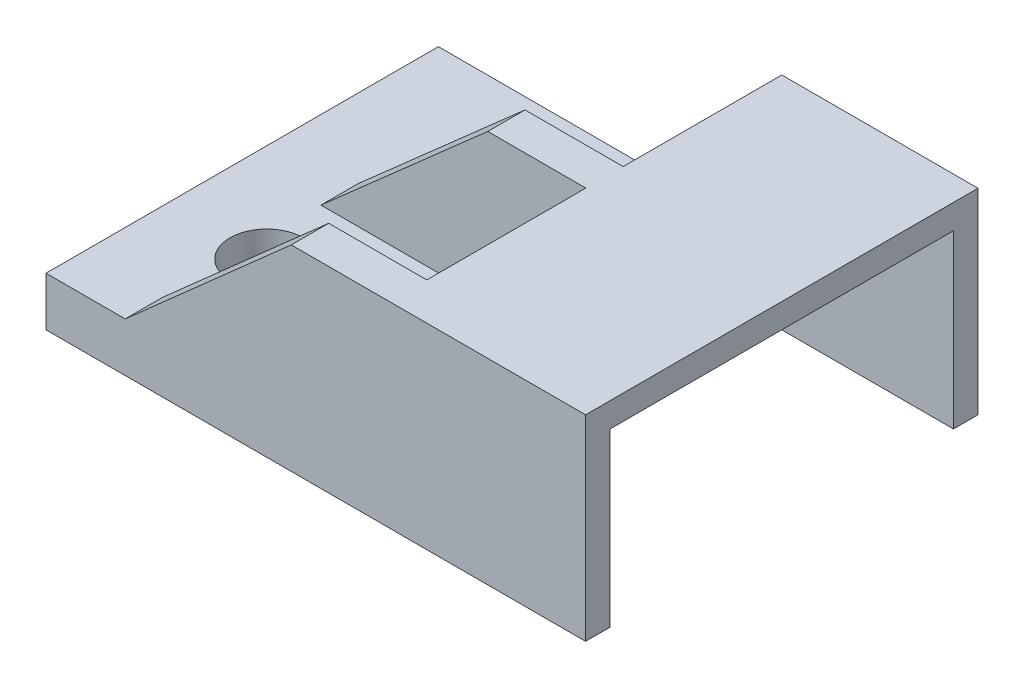
ISO-10303-21;
HEADER;
FILE_DESCRIPTION(('STEP AP214'),'2;1');
FILE_NAME('part.step','',(''),(''),'','','');
FILE_SCHEMA(('AUTOMOTIVE_DESIGN { 1 0 10303 214 1 1 1 1 }'));
ENDSEC;
DATA;
#1=APPLICATION_CONTEXT('core data for automotive mechanical design processes');
#2=APPLICATION_PROTOCOL_DEFINITION('international standard','automotive_design',2000,#1);
#3=PRODUCT_CONTEXT('',#1,'mechanical');
#4=PRODUCT('Part','Part','',(#3));
#5=PRODUCT_RELATED_PRODUCT_CATEGORY('part','',(#4));
#6=PRODUCT_DEFINITION_FORMATION('','',#4);
#7=PRODUCT_DEFINITION_CONTEXT('part definition',#1,'design');
#8=PRODUCT_DEFINITION('design','',#6,#7);
#9=PRODUCT_DEFINITION_SHAPE('','',#8);
#10=(LENGTH_UNIT() NAMED_UNIT(*) SI_UNIT(.MILLI.,.METRE.));
#11=(NAMED_UNIT(*) PLANE_ANGLE_UNIT() SI_UNIT($,.RADIAN.));
#12=(NAMED_UNIT(*) SI_UNIT($,.STERADIAN.) SOLID_ANGLE_UNIT());
#13=UNCERTAINTY_MEASURE_WITH_UNIT(LENGTH_MEASURE(1.E-05),#10,'distance_accuracy_value','');
#14=(GEOMETRIC_REPRESENTATION_CONTEXT(3) GLOBAL_UNCERTAINTY_ASSIGNED_CONTEXT((#13)) GLOBAL_UNIT_ASSIGNED_CONTEXT((#10,
#11,#12)) REPRESENTATION_CONTEXT('',''));
#15=CARTESIAN_POINT('',(0.,0.,0.));
#16=DIRECTION('',(0.,0.,1.));
#17=DIRECTION('',(1.,0.,0.));
#18=AXIS2_PLACEMENT_3D('',#15,#16,#17);
#19=CARTESIAN_POINT('',(0.,12.7,0.));
#20=DIRECTION('',(0.,0.,-1.));
#21=DIRECTION('',(-1.,0.,0.));
#22=AXIS2_PLACEMENT_3D('',#19,#20,#21);
#23=PLANE('',#22);
#24=DIRECTION('',(0.748452550188981,0.663188344375571,0.));
#25=VECTOR('',#24,1.);
#26=CARTESIAN_POINT('',(63.5002717956906,50.8,0.));
#27=LINE('',#26,#25);
#28=CARTESIAN_POINT('',(20.5018650775363,12.7,0.));
#29=VERTEX_POINT('',#28);
#30=CARTESIAN_POINT('',(63.5002717956906,50.8,0.));
#31=VERTEX_POINT('',#30);
#32=EDGE_CURVE('E421',#29,#31,#27,.T.);
#33=ORIENTED_EDGE('',*,*,#32,.F.);
#34=DIRECTION('',(1.,0.,0.));
#35=VECTOR('',#34,1.);
#36=CARTESIAN_POINT('',(0.,12.7,0.));
#37=LINE('',#36,#35);
#38=CARTESIAN_POINT('',(0.,12.7,0.));
#39=VERTEX_POINT('',#38);
#40=EDGE_CURVE('E299',#39,#29,#37,.T.);
#41=ORIENTED_EDGE('',*,*,#40,.F.);
#42=DIRECTION('',(0.,-1.,0.));
#43=VECTOR('',#42,1.);
#44=CARTESIAN_POINT('',(0.,12.7,0.));
#45=LINE('',#44,#43);
#46=CARTESIAN_POINT('',(0.,0.,0.));
#47=VERTEX_POINT('',#46);
#48=EDGE_CURVE('E69',#39,#47,#45,.T.);
#49=ORIENTED_EDGE('',*,*,#48,.T.);
#50=DIRECTION('',(1.,0.,0.));
#51=VECTOR('',#50,1.);
#52=CARTESIAN_POINT('',(0.,0.,0.));
#53=LINE('',#52,#51);
#54=CARTESIAN_POINT('',(139.7,0.,0.));
#55=VERTEX_POINT('',#54);
#56=EDGE_CURVE('E316',#47,#55,#53,.T.);
#57=ORIENTED_EDGE('',*,*,#56,.T.);
#58=DIRECTION('',(0.,-1.,0.));
#59=VECTOR('',#58,1.);
#60=CARTESIAN_POINT('',(139.7,12.7,0.));
#61=LINE('',#60,#59);
#62=CARTESIAN_POINT('',(139.7,50.8,0.));
#63=VERTEX_POINT('',#62);
#64=EDGE_CURVE('E324',#63,#55,#61,.T.);
#65=ORIENTED_EDGE('',*,*,#64,.F.);
#66=DIRECTION('',(1.,0.,0.));
#67=VECTOR('',#66,1.);
#68=CARTESIAN_POINT('',(88.9,50.8,0.));
#69=LINE('',#68,#67);
#70=EDGE_CURVE('E243',#31,#63,#69,.T.);
#71=ORIENTED_EDGE('',*,*,#70,.F.);
#72=EDGE_LOOP('',(#33,#41,#49,#57,#65,#71));
#73=FACE_BOUND('',#72,.T.);
#74=ADVANCED_FACE('F59',(#73),#23,.F.);
#75=CARTESIAN_POINT('',(0.,12.7,0.));
#76=DIRECTION('',(0.,1.,0.));
#77=DIRECTION('',(0.,0.,1.));
#78=AXIS2_PLACEMENT_3D('',#75,#76,#77);
#79=PLANE('',#78);
#80=DIRECTION('',(0.,0.,1.));
#81=VECTOR('',#80,1.);
#82=CARTESIAN_POINT('',(20.3202717956906,12.7,-60.5191424248304));
#83=LINE('',#82,#81);
#84=CARTESIAN_POINT('',(20.3202717956906,12.7,-60.5191424248304));
#85=VERTEX_POINT('',#84);
#86=CARTESIAN_POINT('',(20.3202717956906,12.7,-50.8671424248304));
#87=VERTEX_POINT('',#86);
#88=EDGE_CURVE('E180',#85,#87,#83,.T.);
#89=ORIENTED_EDGE('',*,*,#88,.F.);
#90=DIRECTION('',(-1.,0.,0.));
#91=VECTOR('',#90,1.);
#92=CARTESIAN_POINT('',(88.9,12.7,-60.5191424248304));
#93=LINE('',#92,#91);
#94=CARTESIAN_POINT('',(88.9,12.7,-60.5191424248304));
#95=VERTEX_POINT('',#94);
#96=EDGE_CURVE('E212',#95,#85,#93,.T.);
#97=ORIENTED_EDGE('',*,*,#96,.F.);
#98=DIRECTION('',(0.,0.,-1.));
#99=VECTOR('',#98,1.);
#100=CARTESIAN_POINT('',(88.9,12.7,0.));
#101=LINE('',#100,#99);
#102=CARTESIAN_POINT('',(88.9,12.7,-101.6));
#103=VERTEX_POINT('',#102);
#104=EDGE_CURVE('E258',#95,#103,#101,.T.);
#105=ORIENTED_EDGE('',*,*,#104,.T.);
#106=DIRECTION('',(1.,0.,0.));
#107=VECTOR('',#106,1.);
#108=CARTESIAN_POINT('',(0.,12.7,-101.6));
#109=LINE('',#108,#107);
#110=CARTESIAN_POINT('',(0.,12.7,-101.6));
#111=VERTEX_POINT('',#110);
#112=EDGE_CURVE('E295',#111,#103,#109,.T.);
#113=ORIENTED_EDGE('',*,*,#112,.F.);
#114=DIRECTION('',(0.,0.,-1.));
#115=VECTOR('',#114,1.);
#116=CARTESIAN_POINT('',(0.,12.7,0.));
#117=LINE('',#116,#115);
#118=EDGE_CURVE('E303',#39,#111,#117,.T.);
#119=ORIENTED_EDGE('',*,*,#118,.F.);
#120=ORIENTED_EDGE('',*,*,#40,.T.);
#121=DIRECTION('',(0.,0.,1.));
#122=VECTOR('',#121,1.);
#123=CARTESIAN_POINT('',(20.5018650775363,12.7,-9.6856743400453));
#124=LINE('',#123,#122);
#125=CARTESIAN_POINT('',(20.5018650775363,12.7,-9.6856743400453));
#126=VERTEX_POINT('',#125);
#127=EDGE_CURVE('E407',#126,#29,#124,.T.);
#128=ORIENTED_EDGE('',*,*,#127,.F.);
#129=DIRECTION('',(1.,0.,0.));
#130=VECTOR('',#129,1.);
#131=CARTESIAN_POINT('',(63.6818650775363,12.7,-9.6856743400453));
#132=LINE('',#131,#130);
#133=CARTESIAN_POINT('',(88.9,12.7,-9.6856743400453));
#134=VERTEX_POINT('',#133);
#135=EDGE_CURVE('E220',#126,#134,#132,.T.);
#136=ORIENTED_EDGE('',*,*,#135,.T.);
#137=CARTESIAN_POINT('',(88.9,12.7,-50.8671424248304));
#138=VERTEX_POINT('',#137);
#139=EDGE_CURVE('E267',#134,#138,#101,.T.);
#140=ORIENTED_EDGE('',*,*,#139,.T.);
#141=DIRECTION('',(1.,0.,0.));
#142=VECTOR('',#141,1.);
#143=CARTESIAN_POINT('',(63.5,12.7,-50.8671424248304));
#144=LINE('',#143,#142);
#145=EDGE_CURVE('E208',#87,#138,#144,.T.);
#146=ORIENTED_EDGE('',*,*,#145,.F.);
#147=EDGE_LOOP('',(#89,#97,#105,#113,#119,#120,#128,#136,#140,#146));
#148=FACE_BOUND('',#147,.T.);
#149=CARTESIAN_POINT('',(25.4,12.7,-31.75));
#150=DIRECTION('',(0.,1.,0.));
#151=DIRECTION('',(0.,0.,1.));
#152=AXIS2_PLACEMENT_3D('',#149,#150,#151);
#153=CIRCLE('',#152,9.525);
#154=CARTESIAN_POINT('',(25.4,12.7,-22.225));
#155=VERTEX_POINT('',#154);
#156=EDGE_CURVE('E399',#155,#155,#153,.T.);
#157=ORIENTED_EDGE('',*,*,#156,.F.);
#158=EDGE_LOOP('',(#157));
#159=FACE_BOUND('',#158,.T.);
#160=ADVANCED_FACE('F349',(#148,#159),#79,.T.);
#161=CARTESIAN_POINT('',(88.9,44.45,0.));
#162=DIRECTION('',(-1.,0.,0.));
#163=DIRECTION('',(0.,0.,1.));
#164=AXIS2_PLACEMENT_3D('',#161,#162,#163);
#165=PLANE('',#164);
#166=ORIENTED_EDGE('',*,*,#104,.F.);
#167=DIRECTION('',(0.,-1.,0.));
#168=VECTOR('',#167,1.);
#169=CARTESIAN_POINT('',(88.9,50.8,-60.5191424248304));
#170=LINE('',#169,#168);
#171=CARTESIAN_POINT('',(88.9,50.8,-60.5191424248304));
#172=VERTEX_POINT('',#171);
#173=EDGE_CURVE('E206',#172,#95,#170,.T.);
#174=ORIENTED_EDGE('',*,*,#173,.F.);
#175=DIRECTION('',(0.,0.,1.));
#176=VECTOR('',#175,1.);
#177=CARTESIAN_POINT('',(88.9,50.8,-101.6));
#178=LINE('',#177,#176);
#179=CARTESIAN_POINT('',(88.9,50.8,-101.6));
#180=VERTEX_POINT('',#179);
#181=EDGE_CURVE('E255',#180,#172,#178,.T.);
#182=ORIENTED_EDGE('',*,*,#181,.F.);
#183=DIRECTION('',(0.,-1.,0.));
#184=VECTOR('',#183,1.);
#185=CARTESIAN_POINT('',(88.9,44.45,-101.6));
#186=LINE('',#185,#184);
#187=EDGE_CURVE('E266',#180,#103,#186,.T.);
#188=ORIENTED_EDGE('',*,*,#187,.T.);
#189=EDGE_LOOP('',(#166,#174,#182,#188));
#190=FACE_BOUND('',#189,.T.);
#191=ADVANCED_FACE('F480',(#190),#165,.T.);
#192=CARTESIAN_POINT('',(88.9,50.8,-50.8671424248304));
#193=VERTEX_POINT('',#192);
#194=CARTESIAN_POINT('',(88.9,50.8,-9.6856743400453));
#195=VERTEX_POINT('',#194);
#196=EDGE_CURVE('E254',#193,#195,#178,.T.);
#197=ORIENTED_EDGE('',*,*,#196,.F.);
#198=DIRECTION('',(0.,-1.,0.));
#199=VECTOR('',#198,1.);
#200=CARTESIAN_POINT('',(88.9,50.8,-50.8671424248304));
#201=LINE('',#200,#199);
#202=EDGE_CURVE('E198',#193,#138,#201,.T.);
#203=ORIENTED_EDGE('',*,*,#202,.T.);
#204=ORIENTED_EDGE('',*,*,#139,.F.);
#205=DIRECTION('',(0.,-1.,0.));
#206=VECTOR('',#205,1.);
#207=CARTESIAN_POINT('',(88.9,50.8,-9.6856743400453));
#208=LINE('',#207,#206);
#209=EDGE_CURVE('E224',#195,#134,#208,.T.);
#210=ORIENTED_EDGE('',*,*,#209,.F.);
#211=EDGE_LOOP('',(#197,#203,#204,#210));
#212=FACE_BOUND('',#211,.T.);
#213=ADVANCED_FACE('F440',(#212),#165,.T.);
#214=CARTESIAN_POINT('',(139.7,12.7,0.));
#215=DIRECTION('',(-1.,0.,0.));
#216=DIRECTION('',(0.,0.,1.));
#217=AXIS2_PLACEMENT_3D('',#214,#215,#216);
#218=PLANE('',#217);
#219=DIRECTION('',(0.,-1.,0.));
#220=VECTOR('',#219,1.);
#221=CARTESIAN_POINT('',(139.7,44.45,-95.25));
#222=LINE('',#221,#220);
#223=CARTESIAN_POINT('',(139.7,44.45,-95.25));
#224=VERTEX_POINT('',#223);
#225=CARTESIAN_POINT('',(139.7,0.,-95.25));
#226=VERTEX_POINT('',#225);
#227=EDGE_CURVE('E281',#224,#226,#222,.T.);
#228=ORIENTED_EDGE('',*,*,#227,.T.);
#229=DIRECTION('',(0.,0.,-1.));
#230=VECTOR('',#229,1.);
#231=CARTESIAN_POINT('',(139.7,0.,0.));
#232=LINE('',#231,#230);
#233=CARTESIAN_POINT('',(139.7,0.,-101.6));
#234=VERTEX_POINT('',#233);
#235=EDGE_CURVE('E311',#226,#234,#232,.T.);
#236=ORIENTED_EDGE('',*,*,#235,.T.);
#237=DIRECTION('',(0.,-1.,0.));
#238=VECTOR('',#237,1.);
#239=CARTESIAN_POINT('',(139.7,12.7,-101.6));
#240=LINE('',#239,#238);
#241=CARTESIAN_POINT('',(139.7,50.8,-101.6));
#242=VERTEX_POINT('',#241);
#243=EDGE_CURVE('E307',#242,#234,#240,.T.);
#244=ORIENTED_EDGE('',*,*,#243,.F.);
#245=DIRECTION('',(0.,0.,-1.));
#246=VECTOR('',#245,1.);
#247=CARTESIAN_POINT('',(139.7,50.8,0.));
#248=LINE('',#247,#246);
#249=EDGE_CURVE('E246',#63,#242,#248,.T.);
#250=ORIENTED_EDGE('',*,*,#249,.F.);
#251=ORIENTED_EDGE('',*,*,#64,.T.);
#252=CARTESIAN_POINT('',(139.7,0.,-6.35));
#253=VERTEX_POINT('',#252);
#254=EDGE_CURVE('E312',#55,#253,#232,.T.);
#255=ORIENTED_EDGE('',*,*,#254,.T.);
#256=DIRECTION('',(0.,-1.,0.));
#257=VECTOR('',#256,1.);
#258=CARTESIAN_POINT('',(139.7,44.45,-6.35));
#259=LINE('',#258,#257);
#260=CARTESIAN_POINT('',(139.7,44.45,-6.35));
#261=VERTEX_POINT('',#260);
#262=EDGE_CURVE('E291',#261,#253,#259,.T.);
#263=ORIENTED_EDGE('',*,*,#262,.F.);
#264=DIRECTION('',(0.,0.,-1.));
#265=VECTOR('',#264,1.);
#266=CARTESIAN_POINT('',(139.7,44.45,0.));
#267=LINE('',#266,#265);
#268=EDGE_CURVE('E242',#261,#224,#267,.T.);
#269=ORIENTED_EDGE('',*,*,#268,.T.);
#270=EDGE_LOOP('',(#228,#236,#244,#250,#251,#255,#263,#269));
#271=FACE_BOUND('',#270,.T.);
#272=ADVANCED_FACE('F448',(#271),#218,.F.);
#273=CARTESIAN_POINT('',(0.,0.,0.));
#274=DIRECTION('',(0.,1.,0.));
#275=DIRECTION('',(0.,0.,1.));
#276=AXIS2_PLACEMENT_3D('',#273,#274,#275);
#277=PLANE('',#276);
#278=CARTESIAN_POINT('',(25.4,0.,-31.75));
#279=DIRECTION('',(0.,1.,0.));
#280=DIRECTION('',(0.,0.,1.));
#281=AXIS2_PLACEMENT_3D('',#278,#279,#280);
#282=CIRCLE('',#281,9.525);
#283=CARTESIAN_POINT('',(25.4,0.,-22.225));
#284=VERTEX_POINT('',#283);
#285=EDGE_CURVE('E63',#284,#284,#282,.T.);
#286=ORIENTED_EDGE('',*,*,#285,.T.);
#287=EDGE_LOOP('',(#286));
#288=FACE_BOUND('',#287,.T.);
#289=DIRECTION('',(1.,0.,0.));
#290=VECTOR('',#289,1.);
#291=CARTESIAN_POINT('',(95.25,0.,-95.25));
#292=LINE('',#291,#290);
#293=CARTESIAN_POINT('',(95.25,0.,-95.25));
#294=VERTEX_POINT('',#293);
#295=EDGE_CURVE('E230',#294,#226,#292,.T.);
#296=ORIENTED_EDGE('',*,*,#295,.F.);
#297=DIRECTION('',(0.,0.,1.));
#298=VECTOR('',#297,1.);
#299=CARTESIAN_POINT('',(95.25,0.,-95.25));
#300=LINE('',#299,#298);
#301=CARTESIAN_POINT('',(95.25,0.,-6.34999999999999));
#302=VERTEX_POINT('',#301);
#303=EDGE_CURVE('E238',#294,#302,#300,.T.);
#304=ORIENTED_EDGE('',*,*,#303,.T.);
#305=DIRECTION('',(-1.,0.,0.));
#306=VECTOR('',#305,1.);
#307=CARTESIAN_POINT('',(139.7,0.,-6.35));
#308=LINE('',#307,#306);
#309=EDGE_CURVE('E234',#253,#302,#308,.T.);
#310=ORIENTED_EDGE('',*,*,#309,.F.);
#311=ORIENTED_EDGE('',*,*,#254,.F.);
#312=ORIENTED_EDGE('',*,*,#56,.F.);
#313=DIRECTION('',(0.,0.,-1.));
#314=VECTOR('',#313,1.);
#315=CARTESIAN_POINT('',(0.,0.,0.));
#316=LINE('',#315,#314);
#317=CARTESIAN_POINT('',(0.,0.,-101.6));
#318=VERTEX_POINT('',#317);
#319=EDGE_CURVE('E300',#47,#318,#316,.T.);
#320=ORIENTED_EDGE('',*,*,#319,.T.);
#321=DIRECTION('',(1.,0.,0.));
#322=VECTOR('',#321,1.);
#323=CARTESIAN_POINT('',(0.,0.,-101.6));
#324=LINE('',#323,#322);
#325=EDGE_CURVE('E294',#318,#234,#324,.T.);
#326=ORIENTED_EDGE('',*,*,#325,.T.);
#327=ORIENTED_EDGE('',*,*,#235,.F.);
#328=EDGE_LOOP('',(#296,#304,#310,#311,#312,#320,#326,#327));
#329=FACE_BOUND('',#328,.T.);
#330=ADVANCED_FACE('F339',(#288,#329),#277,.F.);
#331=CARTESIAN_POINT('',(0.,12.7,-101.6));
#332=DIRECTION('',(0.,0.,-1.));
#333=DIRECTION('',(-1.,0.,0.));
#334=AXIS2_PLACEMENT_3D('',#331,#332,#333);
#335=PLANE('',#334);
#336=ORIENTED_EDGE('',*,*,#325,.F.);
#337=DIRECTION('',(0.,-1.,0.));
#338=VECTOR('',#337,1.);
#339=CARTESIAN_POINT('',(0.,12.7,-101.6));
#340=LINE('',#339,#338);
#341=EDGE_CURVE('E13',#111,#318,#340,.T.);
#342=ORIENTED_EDGE('',*,*,#341,.F.);
#343=ORIENTED_EDGE('',*,*,#112,.T.);
#344=ORIENTED_EDGE('',*,*,#187,.F.);
#345=DIRECTION('',(-1.,0.,0.));
#346=VECTOR('',#345,1.);
#347=CARTESIAN_POINT('',(139.7,50.8,-101.6));
#348=LINE('',#347,#346);
#349=EDGE_CURVE('E250',#242,#180,#348,.T.);
#350=ORIENTED_EDGE('',*,*,#349,.F.);
#351=ORIENTED_EDGE('',*,*,#243,.T.);
#352=EDGE_LOOP('',(#336,#342,#343,#344,#350,#351));
#353=FACE_BOUND('',#352,.T.);
#354=ADVANCED_FACE('F61',(#353),#335,.T.);
#355=CARTESIAN_POINT('',(0.,12.7,0.));
#356=DIRECTION('',(-1.,0.,0.));
#357=DIRECTION('',(0.,0.,1.));
#358=AXIS2_PLACEMENT_3D('',#355,#356,#357);
#359=PLANE('',#358);
#360=ORIENTED_EDGE('',*,*,#319,.F.);
#361=ORIENTED_EDGE('',*,*,#48,.F.);
#362=ORIENTED_EDGE('',*,*,#118,.T.);
#363=ORIENTED_EDGE('',*,*,#341,.T.);
#364=EDGE_LOOP('',(#360,#361,#362,#363));
#365=FACE_BOUND('',#364,.T.);
#366=ADVANCED_FACE('F344',(#365),#359,.T.);
#367=CARTESIAN_POINT('',(139.7,44.45,-6.35));
#368=DIRECTION('',(0.,0.,1.));
#369=DIRECTION('',(1.,0.,0.));
#370=AXIS2_PLACEMENT_3D('',#367,#368,#369);
#371=PLANE('',#370);
#372=ORIENTED_EDGE('',*,*,#262,.T.);
#373=ORIENTED_EDGE('',*,*,#309,.T.);
#374=DIRECTION('',(0.,-1.,0.));
#375=VECTOR('',#374,1.);
#376=CARTESIAN_POINT('',(95.25,44.45,-6.34999999999999));
#377=LINE('',#376,#375);
#378=CARTESIAN_POINT('',(95.25,44.45,-6.34999999999999));
#379=VERTEX_POINT('',#378);
#380=EDGE_CURVE('E288',#379,#302,#377,.T.);
#381=ORIENTED_EDGE('',*,*,#380,.F.);
#382=DIRECTION('',(-1.,0.,0.));
#383=VECTOR('',#382,1.);
#384=CARTESIAN_POINT('',(139.7,44.45,-6.35));
#385=LINE('',#384,#383);
#386=EDGE_CURVE('E284',#261,#379,#385,.T.);
#387=ORIENTED_EDGE('',*,*,#386,.F.);
#388=EDGE_LOOP('',(#372,#373,#381,#387));
#389=FACE_BOUND('',#388,.T.);
#390=ADVANCED_FACE('F452',(#389),#371,.F.);
#391=CARTESIAN_POINT('',(95.25,44.45,-95.25));
#392=DIRECTION('',(0.,0.,-1.));
#393=DIRECTION('',(-1.,0.,0.));
#394=AXIS2_PLACEMENT_3D('',#391,#392,#393);
#395=PLANE('',#394);
#396=DIRECTION('',(0.,-1.,0.));
#397=VECTOR('',#396,1.);
#398=CARTESIAN_POINT('',(95.25,44.45,-95.25));
#399=LINE('',#398,#397);
#400=CARTESIAN_POINT('',(95.25,44.45,-95.25));
#401=VERTEX_POINT('',#400);
#402=EDGE_CURVE('E278',#401,#294,#399,.T.);
#403=ORIENTED_EDGE('',*,*,#402,.T.);
#404=ORIENTED_EDGE('',*,*,#295,.T.);
#405=ORIENTED_EDGE('',*,*,#227,.F.);
#406=DIRECTION('',(1.,0.,0.));
#407=VECTOR('',#406,1.);
#408=CARTESIAN_POINT('',(95.25,44.45,-95.25));
#409=LINE('',#408,#407);
#410=EDGE_CURVE('E274',#401,#224,#409,.T.);
#411=ORIENTED_EDGE('',*,*,#410,.F.);
#412=EDGE_LOOP('',(#403,#404,#405,#411));
#413=FACE_BOUND('',#412,.T.);
#414=ADVANCED_FACE('F460',(#413),#395,.F.);
#415=CARTESIAN_POINT('',(95.25,44.45,-101.6));
#416=DIRECTION('',(1.,0.,0.));
#417=DIRECTION('',(0.,0.,-1.));
#418=AXIS2_PLACEMENT_3D('',#415,#416,#417);
#419=PLANE('',#418);
#420=ORIENTED_EDGE('',*,*,#380,.T.);
#421=ORIENTED_EDGE('',*,*,#303,.F.);
#422=ORIENTED_EDGE('',*,*,#402,.F.);
#423=DIRECTION('',(0.,0.,1.));
#424=VECTOR('',#423,1.);
#425=CARTESIAN_POINT('',(95.25,44.45,-101.6));
#426=LINE('',#425,#424);
#427=EDGE_CURVE('E262',#401,#379,#426,.T.);
#428=ORIENTED_EDGE('',*,*,#427,.T.);
#429=EDGE_LOOP('',(#420,#421,#422,#428));
#430=FACE_BOUND('',#429,.T.);
#431=ADVANCED_FACE('F462',(#430),#419,.T.);
#432=CARTESIAN_POINT('',(0.,44.45,0.));
#433=DIRECTION('',(0.,1.,0.));
#434=DIRECTION('',(0.,0.,1.));
#435=AXIS2_PLACEMENT_3D('',#432,#433,#434);
#436=PLANE('',#435);
#437=ORIENTED_EDGE('',*,*,#268,.F.);
#438=ORIENTED_EDGE('',*,*,#386,.T.);
#439=ORIENTED_EDGE('',*,*,#427,.F.);
#440=ORIENTED_EDGE('',*,*,#410,.T.);
#441=EDGE_LOOP('',(#437,#438,#439,#440));
#442=FACE_BOUND('',#441,.T.);
#443=ADVANCED_FACE('F456',(#442),#436,.F.);
#444=CARTESIAN_POINT('',(0.,50.8,0.));
#445=DIRECTION('',(0.,1.,0.));
#446=DIRECTION('',(0.,0.,1.));
#447=AXIS2_PLACEMENT_3D('',#444,#445,#446);
#448=PLANE('',#447);
#449=DIRECTION('',(0.,0.,1.));
#450=VECTOR('',#449,1.);
#451=CARTESIAN_POINT('',(63.5002717956906,50.8,-88.9671424248304));
#452=LINE('',#451,#450);
#453=CARTESIAN_POINT('',(63.5002717956906,50.8,-60.5191424248304));
#454=VERTEX_POINT('',#453);
#455=CARTESIAN_POINT('',(63.5002717956906,50.8,-50.8671424248304));
#456=VERTEX_POINT('',#455);
#457=EDGE_CURVE('E177',#454,#456,#452,.T.);
#458=ORIENTED_EDGE('',*,*,#457,.T.);
#459=DIRECTION('',(1.,0.,0.));
#460=VECTOR('',#459,1.);
#461=CARTESIAN_POINT('',(63.5,50.8,-50.8671424248304));
#462=LINE('',#461,#460);
#463=EDGE_CURVE('E189',#456,#193,#462,.T.);
#464=ORIENTED_EDGE('',*,*,#463,.T.);
#465=ORIENTED_EDGE('',*,*,#196,.T.);
#466=DIRECTION('',(1.,0.,0.));
#467=VECTOR('',#466,1.);
#468=CARTESIAN_POINT('',(63.6818650775363,50.8,-9.6856743400453));
#469=LINE('',#468,#467);
#470=CARTESIAN_POINT('',(63.5002717956906,50.8,-9.6856743400453));
#471=VERTEX_POINT('',#470);
#472=EDGE_CURVE('E221',#471,#195,#469,.T.);
#473=ORIENTED_EDGE('',*,*,#472,.F.);
#474=DIRECTION('',(0.,0.,-1.));
#475=VECTOR('',#474,1.);
#476=CARTESIAN_POINT('',(63.5002717956906,50.8,237.174062125337));
#477=LINE('',#476,#475);
#478=EDGE_CURVE('E77',#31,#471,#477,.T.);
#479=ORIENTED_EDGE('',*,*,#478,.F.);
#480=ORIENTED_EDGE('',*,*,#70,.T.);
#481=ORIENTED_EDGE('',*,*,#249,.T.);
#482=ORIENTED_EDGE('',*,*,#349,.T.);
#483=ORIENTED_EDGE('',*,*,#181,.T.);
#484=DIRECTION('',(-1.,0.,0.));
#485=VECTOR('',#484,1.);
#486=CARTESIAN_POINT('',(88.9,50.8,-60.5191424248304));
#487=LINE('',#486,#485);
#488=EDGE_CURVE('E192',#172,#454,#487,.T.);
#489=ORIENTED_EDGE('',*,*,#488,.T.);
#490=EDGE_LOOP('',(#458,#464,#465,#473,#479,#480,#481,#482,#483,#489));
#491=FACE_BOUND('',#490,.T.);
#492=ADVANCED_FACE('F187',(#491),#448,.T.);
#493=CARTESIAN_POINT('',(63.6818650775363,50.8,-9.6856743400453));
#494=DIRECTION('',(0.,0.,-1.));
#495=DIRECTION('',(-1.,0.,0.));
#496=AXIS2_PLACEMENT_3D('',#493,#494,#495);
#497=PLANE('',#496);
#498=DIRECTION('',(-0.748452550188981,-0.663188344375571,0.));
#499=VECTOR('',#498,1.);
#500=CARTESIAN_POINT('',(63.6019969418377,50.8901365507241,-9.6856743400453));
#501=LINE('',#500,#499);
#502=EDGE_CURVE('E85',#471,#126,#501,.T.);
#503=ORIENTED_EDGE('',*,*,#502,.F.);
#504=ORIENTED_EDGE('',*,*,#472,.T.);
#505=ORIENTED_EDGE('',*,*,#209,.T.);
#506=ORIENTED_EDGE('',*,*,#135,.F.);
#507=EDGE_LOOP('',(#503,#504,#505,#506));
#508=FACE_BOUND('',#507,.T.);
#509=ADVANCED_FACE('F495',(#508),#497,.T.);
#510=CARTESIAN_POINT('',(88.9,50.8,-60.5191424248304));
#511=DIRECTION('',(0.,0.,1.));
#512=DIRECTION('',(1.,0.,0.));
#513=AXIS2_PLACEMENT_3D('',#510,#511,#512);
#514=PLANE('',#513);
#515=ORIENTED_EDGE('',*,*,#96,.T.);
#516=DIRECTION('',(0.749837855365093,0.661621637086846,0.));
#517=VECTOR('',#516,1.);
#518=CARTESIAN_POINT('',(77.7814419339113,63.4010324749006,-60.5191424248304));
#519=LINE('',#518,#517);
#520=EDGE_CURVE('E194',#85,#454,#519,.T.);
#521=ORIENTED_EDGE('',*,*,#520,.T.);
#522=ORIENTED_EDGE('',*,*,#488,.F.);
#523=ORIENTED_EDGE('',*,*,#173,.T.);
#524=EDGE_LOOP('',(#515,#521,#522,#523));
#525=FACE_BOUND('',#524,.T.);
#526=ADVANCED_FACE('F437',(#525),#514,.F.);
#527=CARTESIAN_POINT('',(63.5,50.8,-50.8671424248304));
#528=DIRECTION('',(0.,0.,-1.));
#529=DIRECTION('',(-1.,0.,0.));
#530=AXIS2_PLACEMENT_3D('',#527,#528,#529);
#531=PLANE('',#530);
#532=ORIENTED_EDGE('',*,*,#463,.F.);
#533=DIRECTION('',(0.749837855365093,0.661621637086846,0.));
#534=VECTOR('',#533,1.);
#535=CARTESIAN_POINT('',(63.5002717956906,50.8,-50.8671424248304));
#536=LINE('',#535,#534);
#537=EDGE_CURVE('E174',#87,#456,#536,.T.);
#538=ORIENTED_EDGE('',*,*,#537,.F.);
#539=ORIENTED_EDGE('',*,*,#145,.T.);
#540=ORIENTED_EDGE('',*,*,#202,.F.);
#541=EDGE_LOOP('',(#532,#538,#539,#540));
#542=FACE_BOUND('',#541,.T.);
#543=ADVANCED_FACE('F196',(#542),#531,.F.);
#544=CARTESIAN_POINT('',(25.4,-25.4,-31.75));
#545=DIRECTION('',(0.,1.,0.));
#546=DIRECTION('',(0.,0.,1.));
#547=AXIS2_PLACEMENT_3D('',#544,#545,#546);
#548=CYLINDRICAL_SURFACE('',#547,9.525);
#549=CARTESIAN_POINT('',(25.4,12.7,-22.225));
#550=CARTESIAN_POINT('',(25.4,12.5677083333333,-22.225));
#551=CARTESIAN_POINT('',(25.4,12.4354166666667,-22.225));
#552=CARTESIAN_POINT('',(25.4,12.1708333333333,-22.225));
#553=CARTESIAN_POINT('',(25.4,12.0385416666667,-22.225));
#554=CARTESIAN_POINT('',(25.4,11.7739583333333,-22.225));
#555=CARTESIAN_POINT('',(25.4,11.6416666666667,-22.225));
#556=CARTESIAN_POINT('',(25.4,11.3770833333333,-22.225));
#557=CARTESIAN_POINT('',(25.4,11.2447916666667,-22.225));
#558=CARTESIAN_POINT('',(25.4,10.9802083333333,-22.225));
#559=CARTESIAN_POINT('',(25.4,10.8479166666667,-22.225));
#560=CARTESIAN_POINT('',(25.4,10.5833333333333,-22.225));
#561=CARTESIAN_POINT('',(25.4,10.4510416666667,-22.225));
#562=CARTESIAN_POINT('',(25.4,10.1864583333333,-22.225));
#563=CARTESIAN_POINT('',(25.4,10.0541666666667,-22.225));
#564=CARTESIAN_POINT('',(25.4,9.78958333333333,-22.225));
#565=CARTESIAN_POINT('',(25.4,9.65729166666667,-22.225));
#566=CARTESIAN_POINT('',(25.4,9.39270833333333,-22.225));
#567=CARTESIAN_POINT('',(25.4,9.26041666666666,-22.225));
#568=CARTESIAN_POINT('',(25.4,8.99583333333333,-22.225));
#569=CARTESIAN_POINT('',(25.4,8.86354166666666,-22.225));
#570=CARTESIAN_POINT('',(25.4,8.59895833333333,-22.225));
#571=CARTESIAN_POINT('',(25.4,8.46666666666667,-22.225));
#572=CARTESIAN_POINT('',(25.4,8.20208333333333,-22.225));
#573=CARTESIAN_POINT('',(25.4,8.06979166666666,-22.225));
#574=CARTESIAN_POINT('',(25.4,7.80520833333333,-22.225));
#575=CARTESIAN_POINT('',(25.4,7.67291666666666,-22.225));
#576=CARTESIAN_POINT('',(25.4,7.40833333333333,-22.225));
#577=CARTESIAN_POINT('',(25.4,7.27604166666667,-22.225));
#578=CARTESIAN_POINT('',(25.4,7.01145833333333,-22.225));
#579=CARTESIAN_POINT('',(25.4,6.87916666666666,-22.225));
#580=CARTESIAN_POINT('',(25.4,6.61458333333333,-22.225));
#581=CARTESIAN_POINT('',(25.4,6.48229166666666,-22.225));
#582=CARTESIAN_POINT('',(25.4,6.21770833333333,-22.225));
#583=CARTESIAN_POINT('',(25.4,6.08541666666667,-22.225));
#584=CARTESIAN_POINT('',(25.4,5.82083333333333,-22.225));
#585=CARTESIAN_POINT('',(25.4,5.68854166666667,-22.225));
#586=CARTESIAN_POINT('',(25.4,5.42395833333333,-22.225));
#587=CARTESIAN_POINT('',(25.4,5.29166666666667,-22.225));
#588=CARTESIAN_POINT('',(25.4,5.02708333333333,-22.225));
#589=CARTESIAN_POINT('',(25.4,4.89479166666667,-22.225));
#590=CARTESIAN_POINT('',(25.4,4.63020833333334,-22.225));
#591=CARTESIAN_POINT('',(25.4,4.49791666666667,-22.225));
#592=CARTESIAN_POINT('',(25.4,4.23333333333333,-22.225));
#593=CARTESIAN_POINT('',(25.4,4.10104166666667,-22.225));
#594=CARTESIAN_POINT('',(25.4,3.83645833333333,-22.225));
#595=CARTESIAN_POINT('',(25.4,3.70416666666667,-22.225));
#596=CARTESIAN_POINT('',(25.4,3.43958333333333,-22.225));
#597=CARTESIAN_POINT('',(25.4,3.30729166666667,-22.225));
#598=CARTESIAN_POINT('',(25.4,3.04270833333333,-22.225));
#599=CARTESIAN_POINT('',(25.4,2.91041666666667,-22.225));
#600=CARTESIAN_POINT('',(25.4,2.64583333333333,-22.225));
#601=CARTESIAN_POINT('',(25.4,2.51354166666667,-22.225));
#602=CARTESIAN_POINT('',(25.4,2.24895833333333,-22.225));
#603=CARTESIAN_POINT('',(25.4,2.11666666666667,-22.225));
#604=CARTESIAN_POINT('',(25.4,1.85208333333333,-22.225));
#605=CARTESIAN_POINT('',(25.4,1.71979166666667,-22.225));
#606=CARTESIAN_POINT('',(25.4,1.45520833333333,-22.225));
#607=CARTESIAN_POINT('',(25.4,1.32291666666667,-22.225));
#608=CARTESIAN_POINT('',(25.4,1.05833333333333,-22.225));
#609=CARTESIAN_POINT('',(25.4,0.926041666666666,-22.225));
#610=CARTESIAN_POINT('',(25.4,0.661458333333332,-22.225));
#611=CARTESIAN_POINT('',(25.4,0.529166666666665,-22.225));
#612=CARTESIAN_POINT('',(25.4,0.264583333333332,-22.225));
#613=CARTESIAN_POINT('',(25.4,0.132291666666666,-22.225));
#614=CARTESIAN_POINT('',(25.4,0.,-22.225));
#615=B_SPLINE_CURVE_WITH_KNOTS('',3,(#549,#550,#551,#552,#553,#554,#555,#556,#557,#558,#559,
#560,#561,#562,#563,#564,#565,#566,#567,#568,#569,#570,#571,#572,#573,#574,#575,#576,#577,#578,
#579,#580,#581,#582,#583,#584,#585,#586,#587,#588,#589,#590,#591,#592,#593,#594,#595,#596,#597,
#598,#599,#600,#601,#602,#603,#604,#605,#606,#607,#608,#609,#610,#611,#612,#613,#614),
.UNSPECIFIED.,.F.,.F.,(4,2,2,2,2,2,2,2,2,2,2,2,2,2,2,2,2,2,2,2,2,2,2,2,2,2,2,2,2,2,2,2,4),(0.,
0.396874999999998,0.793750000000003,1.190625,1.5875,1.984375,2.38125,2.778125,3.175,3.571875,
3.96875,4.365625,4.7625,5.159375,5.55625,5.953125,6.35,6.746875,7.14375,7.540625,7.9375,
8.334375,8.73125,9.128125,9.525,9.921875,10.31875,10.715625,11.1125,11.509375,11.90625,
12.303125,12.7),.UNSPECIFIED.);
#616=EDGE_CURVE('BSEAM501',#155,#284,#615,.T.);
#617=ORIENTED_EDGE('',*,*,#156,.T.);
#618=ORIENTED_EDGE('',*,*,#285,.F.);
#619=ORIENTED_EDGE('',*,*,#616,.T.);
#620=ORIENTED_EDGE('',*,*,#616,.F.);
#621=EDGE_LOOP('',(#617,#619,#618,#620));
#622=FACE_BOUND('',#621,.T.);
#623=ADVANCED_FACE('F501',(#622),#548,.F.);
#624=CARTESIAN_POINT('',(63.5002717956906,50.8,237.174062125337));
#625=DIRECTION('',(0.663188344375571,-0.748452550188981,0.));
#626=DIRECTION('',(0.748452550188981,0.663188344375571,0.));
#627=AXIS2_PLACEMENT_3D('',#624,#625,#626);
#628=PLANE('',#627);
#629=ORIENTED_EDGE('',*,*,#478,.T.);
#630=ORIENTED_EDGE('',*,*,#502,.T.);
#631=ORIENTED_EDGE('',*,*,#127,.T.);
#632=ORIENTED_EDGE('',*,*,#32,.T.);
#633=EDGE_LOOP('',(#629,#630,#631,#632));
#634=FACE_BOUND('',#633,.T.);
#635=ADVANCED_FACE('F443',(#634),#628,.F.);
#636=CARTESIAN_POINT('',(63.5002717956906,50.8,-88.9671424248304));
#637=DIRECTION('',(0.661621637086846,-0.749837855365093,0.));
#638=DIRECTION('',(0.749837855365093,0.661621637086846,0.));
#639=AXIS2_PLACEMENT_3D('',#636,#637,#638);
#640=PLANE('',#639);
#641=ORIENTED_EDGE('',*,*,#88,.T.);
#642=ORIENTED_EDGE('',*,*,#537,.T.);
#643=ORIENTED_EDGE('',*,*,#457,.F.);
#644=ORIENTED_EDGE('',*,*,#520,.F.);
#645=EDGE_LOOP('',(#641,#642,#643,#644));
#646=FACE_BOUND('',#645,.T.);
#647=ADVANCED_FACE('F176',(#646),#640,.F.);
#648=CLOSED_SHELL('',(#74,#160,#191,#213,#272,#330,#354,#366,#390,#414,#431,#443,#492,#509,#526,
#543,#623,#635,#647));
#649=MANIFOLD_SOLID_BREP('B2',#648);
#650=ADVANCED_BREP_SHAPE_REPRESENTATION('',(#18,#649),#14);
#651=SHAPE_DEFINITION_REPRESENTATION(#9,#650);
ENDSEC;
END-ISO-10303-21;
